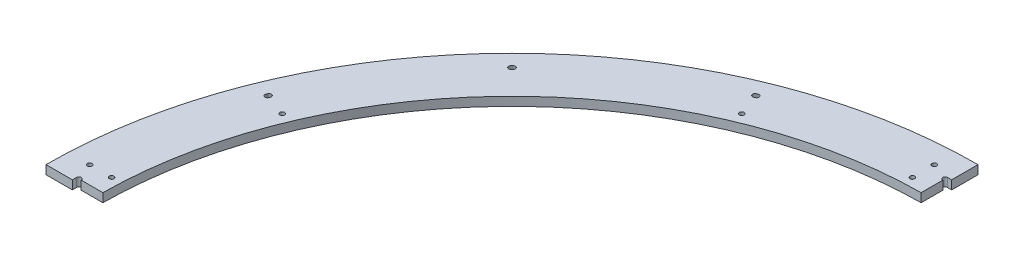
ISO-10303-21;
HEADER;
FILE_DESCRIPTION(('STEP AP214'),'2;1');
FILE_NAME('part.step','',(''),(''),'','','');
FILE_SCHEMA(('AUTOMOTIVE_DESIGN { 1 0 10303 214 1 1 1 1 }'));
ENDSEC;
DATA;
#1=APPLICATION_CONTEXT('core data for automotive mechanical design processes');
#2=APPLICATION_PROTOCOL_DEFINITION('international standard','automotive_design',2000,#1);
#3=PRODUCT_CONTEXT('',#1,'mechanical');
#4=PRODUCT('Part','Part','',(#3));
#5=PRODUCT_RELATED_PRODUCT_CATEGORY('part','',(#4));
#6=PRODUCT_DEFINITION_FORMATION('','',#4);
#7=PRODUCT_DEFINITION_CONTEXT('part definition',#1,'design');
#8=PRODUCT_DEFINITION('design','',#6,#7);
#9=PRODUCT_DEFINITION_SHAPE('','',#8);
#10=(LENGTH_UNIT() NAMED_UNIT(*) SI_UNIT(.MILLI.,.METRE.));
#11=(NAMED_UNIT(*) PLANE_ANGLE_UNIT() SI_UNIT($,.RADIAN.));
#12=(NAMED_UNIT(*) SI_UNIT($,.STERADIAN.) SOLID_ANGLE_UNIT());
#13=UNCERTAINTY_MEASURE_WITH_UNIT(LENGTH_MEASURE(1.E-05),#10,'distance_accuracy_value','');
#14=(GEOMETRIC_REPRESENTATION_CONTEXT(3) GLOBAL_UNCERTAINTY_ASSIGNED_CONTEXT((#13)) GLOBAL_UNIT_ASSIGNED_CONTEXT((#10,
#11,#12)) REPRESENTATION_CONTEXT('',''));
#15=CARTESIAN_POINT('',(0.,0.,0.));
#16=DIRECTION('',(0.,0.,1.));
#17=DIRECTION('',(1.,0.,0.));
#18=AXIS2_PLACEMENT_3D('',#15,#16,#17);
#19=CARTESIAN_POINT('',(0.,12.7,0.));
#20=DIRECTION('',(0.,-1.,0.));
#21=DIRECTION('',(0.,0.,-1.));
#22=AXIS2_PLACEMENT_3D('',#19,#20,#21);
#23=PLANE('',#22);
#24=CARTESIAN_POINT('',(0.,12.7,0.));
#25=DIRECTION('',(0.,1.,0.));
#26=DIRECTION('',(0.,0.,1.));
#27=AXIS2_PLACEMENT_3D('',#24,#25,#26);
#28=CIRCLE('',#27,652.6657);
#29=CARTESIAN_POINT('',(-602.990490798011,12.7,-249.749842770047));
#30=VERTEX_POINT('',#29);
#31=CARTESIAN_POINT('',(-603.807939634826,12.7,-247.767003433541));
#32=VERTEX_POINT('',#31);
#33=EDGE_CURVE('E222',#30,#32,#28,.T.);
#34=ORIENTED_EDGE('',*,*,#33,.F.);
#35=CARTESIAN_POINT('',(-599.869409858698,12.7,-248.457136689666));
#36=DIRECTION('',(0.,1.,0.));
#37=DIRECTION('',(0.,0.,1.));
#38=AXIS2_PLACEMENT_3D('',#35,#36,#37);
#39=CIRCLE('',#38,3.37820000000002);
#40=CARTESIAN_POINT('',(-596.748328919384,12.7,-247.164430609286));
#41=VERTEX_POINT('',#40);
#42=EDGE_CURVE('E58',#41,#30,#39,.T.);
#43=ORIENTED_EDGE('',*,*,#42,.F.);
#44=CARTESIAN_POINT('',(0.,12.7,0.));
#45=DIRECTION('',(0.,-1.,0.));
#46=DIRECTION('',(0.,0.,1.));
#47=AXIS2_PLACEMENT_3D('',#44,#45,#46);
#48=CIRCLE('',#47,645.9093);
#49=CARTESIAN_POINT('',(-597.557315519986,12.7,-245.20211763979));
#50=VERTEX_POINT('',#49);
#51=EDGE_CURVE('E213',#50,#41,#48,.T.);
#52=ORIENTED_EDGE('',*,*,#51,.F.);
#53=CARTESIAN_POINT('',(-600.682627577406,12.7,-246.484560536666));
#54=DIRECTION('',(0.,1.,0.));
#55=DIRECTION('',(0.,0.,1.));
#56=AXIS2_PLACEMENT_3D('',#53,#54,#55);
#57=CIRCLE('',#56,3.37819999999996);
#58=EDGE_CURVE('E216',#32,#50,#57,.T.);
#59=ORIENTED_EDGE('',*,*,#58,.F.);
#60=EDGE_LOOP('',(#34,#43,#52,#59));
#61=FACE_BOUND('',#60,.T.);
#62=CARTESIAN_POINT('',(0.,12.7,0.));
#63=DIRECTION('',(0.,1.,0.));
#64=DIRECTION('',(0.,0.,1.));
#65=AXIS2_PLACEMENT_3D('',#62,#63,#64);
#66=CIRCLE('',#65,652.6657);
#67=CARTESIAN_POINT('',(-460.745442176767,12.7,-462.261996566693));
#68=VERTEX_POINT('',#67);
#69=CARTESIAN_POINT('',(-462.261996566693,12.7,-460.745442176767));
#70=VERTEX_POINT('',#69);
#71=EDGE_CURVE('E248',#68,#70,#66,.T.);
#72=ORIENTED_EDGE('',*,*,#71,.F.);
#73=CARTESIAN_POINT('',(-458.360622118411,12.7,-459.869326817384));
#74=DIRECTION('',(0.,1.,0.));
#75=DIRECTION('',(0.,0.,1.));
#76=AXIS2_PLACEMENT_3D('',#73,#74,#75);
#77=CIRCLE('',#76,3.37819999999989);
#78=CARTESIAN_POINT('',(-455.975802060054,12.7,-457.476657068075));
#79=VERTEX_POINT('',#78);
#80=EDGE_CURVE('E66',#79,#68,#77,.T.);
#81=ORIENTED_EDGE('',*,*,#80,.F.);
#82=CARTESIAN_POINT('',(0.,12.7,0.));
#83=DIRECTION('',(0.,-1.,0.));
#84=DIRECTION('',(0.,0.,1.));
#85=AXIS2_PLACEMENT_3D('',#82,#83,#84);
#86=CIRCLE('',#85,645.9093);
#87=CARTESIAN_POINT('',(-457.476657068075,12.7,-455.975802060054));
#88=VERTEX_POINT('',#87);
#89=EDGE_CURVE('E237',#88,#79,#86,.T.);
#90=ORIENTED_EDGE('',*,*,#89,.F.);
#91=CARTESIAN_POINT('',(-459.869326817384,12.7,-458.360622118411));
#92=DIRECTION('',(0.,1.,0.));
#93=DIRECTION('',(0.,0.,1.));
#94=AXIS2_PLACEMENT_3D('',#91,#92,#93);
#95=CIRCLE('',#94,3.37819999999989);
#96=EDGE_CURVE('E252',#70,#88,#95,.T.);
#97=ORIENTED_EDGE('',*,*,#96,.F.);
#98=EDGE_LOOP('',(#72,#81,#90,#97));
#99=FACE_BOUND('',#98,.T.);
#100=CARTESIAN_POINT('',(0.,12.7,0.));
#101=DIRECTION('',(0.,1.,0.));
#102=DIRECTION('',(0.,0.,1.));
#103=AXIS2_PLACEMENT_3D('',#100,#101,#102);
#104=CIRCLE('',#103,652.6657);
#105=CARTESIAN_POINT('',(-247.767003433541,12.7,-603.807939634826));
#106=VERTEX_POINT('',#105);
#107=CARTESIAN_POINT('',(-249.749842770047,12.7,-602.990490798011));
#108=VERTEX_POINT('',#107);
#109=EDGE_CURVE('E279',#106,#108,#104,.T.);
#110=ORIENTED_EDGE('',*,*,#109,.F.);
#111=CARTESIAN_POINT('',(-246.484560536666,12.7,-600.682627577406));
#112=DIRECTION('',(0.,1.,0.));
#113=DIRECTION('',(0.,0.,1.));
#114=AXIS2_PLACEMENT_3D('',#111,#112,#113);
#115=CIRCLE('',#114,3.37819999999987);
#116=CARTESIAN_POINT('',(-245.202117639791,12.7,-597.557315519986));
#117=VERTEX_POINT('',#116);
#118=EDGE_CURVE('E277',#117,#106,#115,.T.);
#119=ORIENTED_EDGE('',*,*,#118,.F.);
#120=CARTESIAN_POINT('',(0.,12.7,0.));
#121=DIRECTION('',(0.,-1.,0.));
#122=DIRECTION('',(0.,0.,1.));
#123=AXIS2_PLACEMENT_3D('',#120,#121,#122);
#124=CIRCLE('',#123,645.9093);
#125=CARTESIAN_POINT('',(-247.164430609286,12.7,-596.748328919384));
#126=VERTEX_POINT('',#125);
#127=EDGE_CURVE('E267',#126,#117,#124,.T.);
#128=ORIENTED_EDGE('',*,*,#127,.F.);
#129=CARTESIAN_POINT('',(-248.457136689666,12.7,-599.869409858698));
#130=DIRECTION('',(0.,1.,0.));
#131=DIRECTION('',(0.,0.,1.));
#132=AXIS2_PLACEMENT_3D('',#129,#130,#131);
#133=CIRCLE('',#132,3.3781999999999);
#134=EDGE_CURVE('E282',#108,#126,#133,.T.);
#135=ORIENTED_EDGE('',*,*,#134,.F.);
#136=EDGE_LOOP('',(#110,#119,#128,#135));
#137=FACE_BOUND('',#136,.T.);
#138=CARTESIAN_POINT('',(-31.75,12.7,-642.9375));
#139=DIRECTION('',(0.,1.,0.));
#140=DIRECTION('',(0.,0.,1.));
#141=AXIS2_PLACEMENT_3D('',#138,#139,#140);
#142=CIRCLE('',#141,3.3782);
#143=CARTESIAN_POINT('',(-31.75,12.7,-639.5593));
#144=VERTEX_POINT('',#143);
#145=EDGE_CURVE('E314',#144,#144,#142,.T.);
#146=ORIENTED_EDGE('',*,*,#145,.F.);
#147=EDGE_LOOP('',(#146));
#148=FACE_BOUND('',#147,.T.);
#149=CARTESIAN_POINT('',(-31.75,12.7,-611.1875));
#150=DIRECTION('',(0.,1.,0.));
#151=DIRECTION('',(0.,0.,1.));
#152=AXIS2_PLACEMENT_3D('',#149,#150,#151);
#153=CIRCLE('',#152,3.3782);
#154=CARTESIAN_POINT('',(-31.75,12.7,-607.8093));
#155=VERTEX_POINT('',#154);
#156=EDGE_CURVE('E320',#155,#155,#153,.T.);
#157=ORIENTED_EDGE('',*,*,#156,.F.);
#158=EDGE_LOOP('',(#157));
#159=FACE_BOUND('',#158,.T.);
#160=CARTESIAN_POINT('',(-611.1875,12.7,-31.75));
#161=DIRECTION('',(0.,1.,0.));
#162=DIRECTION('',(0.,0.,1.));
#163=AXIS2_PLACEMENT_3D('',#160,#161,#162);
#164=CIRCLE('',#163,3.3782);
#165=CARTESIAN_POINT('',(-611.1875,12.7,-28.3718));
#166=VERTEX_POINT('',#165);
#167=EDGE_CURVE('E326',#166,#166,#164,.T.);
#168=ORIENTED_EDGE('',*,*,#167,.F.);
#169=EDGE_LOOP('',(#168));
#170=FACE_BOUND('',#169,.T.);
#171=CARTESIAN_POINT('',(-642.9375,12.7,-31.75));
#172=DIRECTION('',(0.,1.,0.));
#173=DIRECTION('',(0.,0.,1.));
#174=AXIS2_PLACEMENT_3D('',#171,#172,#173);
#175=CIRCLE('',#174,3.3782);
#176=CARTESIAN_POINT('',(-642.9375,12.7,-28.3718));
#177=VERTEX_POINT('',#176);
#178=EDGE_CURVE('E332',#177,#177,#175,.T.);
#179=ORIENTED_EDGE('',*,*,#178,.F.);
#180=EDGE_LOOP('',(#179));
#181=FACE_BOUND('',#180,.T.);
#182=CARTESIAN_POINT('',(-567.596939292465,12.7,-235.106350216397));
#183=DIRECTION('',(0.,1.,0.));
#184=DIRECTION('',(0.,0.,1.));
#185=AXIS2_PLACEMENT_3D('',#182,#183,#184);
#186=CIRCLE('',#185,3.3782);
#187=CARTESIAN_POINT('',(-567.596939292465,12.7,-231.728150216397));
#188=VERTEX_POINT('',#187);
#189=EDGE_CURVE('E338',#188,#188,#186,.T.);
#190=ORIENTED_EDGE('',*,*,#189,.F.);
#191=EDGE_LOOP('',(#190));
#192=FACE_BOUND('',#191,.T.);
#193=CARTESIAN_POINT('',(-235.106350216398,12.7,-567.596939292465));
#194=DIRECTION('',(0.,1.,0.));
#195=DIRECTION('',(0.,0.,1.));
#196=AXIS2_PLACEMENT_3D('',#193,#194,#195);
#197=CIRCLE('',#196,3.3782);
#198=CARTESIAN_POINT('',(-235.106350216398,12.7,-564.218739292465));
#199=VERTEX_POINT('',#198);
#200=EDGE_CURVE('E344',#199,#199,#197,.T.);
#201=ORIENTED_EDGE('',*,*,#200,.F.);
#202=EDGE_LOOP('',(#201));
#203=FACE_BOUND('',#202,.T.);
#204=DIRECTION('',(-1.,0.,0.));
#205=VECTOR('',#204,1.);
#206=CARTESIAN_POINT('',(-6.35,12.7,-636.5875));
#207=LINE('',#206,#205);
#208=CARTESIAN_POINT('',(-0.317499999999959,12.7,-636.5875));
#209=VERTEX_POINT('',#208);
#210=CARTESIAN_POINT('',(-6.35,12.7,-636.5875));
#211=VERTEX_POINT('',#210);
#212=EDGE_CURVE('E367',#209,#211,#207,.T.);
#213=ORIENTED_EDGE('',*,*,#212,.F.);
#214=DIRECTION('',(0.,0.,1.));
#215=VECTOR('',#214,1.);
#216=CARTESIAN_POINT('',(-0.317499999999959,12.7,-674.6875));
#217=LINE('',#216,#215);
#218=CARTESIAN_POINT('',(-0.317499999999959,12.7,-674.687425294113));
#219=VERTEX_POINT('',#218);
#220=EDGE_CURVE('E298',#219,#209,#217,.T.);
#221=ORIENTED_EDGE('',*,*,#220,.F.);
#222=CARTESIAN_POINT('',(0.,12.7,0.));
#223=DIRECTION('',(0.,1.,0.));
#224=DIRECTION('',(0.,0.,-1.));
#225=AXIS2_PLACEMENT_3D('',#222,#223,#224);
#226=CIRCLE('',#225,674.6875);
#227=CARTESIAN_POINT('',(-674.687425294113,12.7,-0.317499999999971));
#228=VERTEX_POINT('',#227);
#229=EDGE_CURVE('E51',#219,#228,#226,.T.);
#230=ORIENTED_EDGE('',*,*,#229,.T.);
#231=DIRECTION('',(-1.,0.,0.));
#232=VECTOR('',#231,1.);
#233=CARTESIAN_POINT('',(-674.6875,12.7,-0.317499999999971));
#234=LINE('',#233,#232);
#235=CARTESIAN_POINT('',(-636.5875,12.7,-0.317500000000082));
#236=VERTEX_POINT('',#235);
#237=EDGE_CURVE('E229',#236,#228,#234,.T.);
#238=ORIENTED_EDGE('',*,*,#237,.F.);
#239=DIRECTION('',(0.,0.,1.));
#240=VECTOR('',#239,1.);
#241=CARTESIAN_POINT('',(-636.5875,12.7,6.35000000000012));
#242=LINE('',#241,#240);
#243=CARTESIAN_POINT('',(-636.5875,12.7,-6.34999999999988));
#244=VERTEX_POINT('',#243);
#245=EDGE_CURVE('E384',#244,#236,#242,.T.);
#246=ORIENTED_EDGE('',*,*,#245,.F.);
#247=CARTESIAN_POINT('',(-633.1585,12.7,-6.34999999999988));
#248=DIRECTION('',(0.,1.,0.));
#249=DIRECTION('',(0.,0.,1.));
#250=AXIS2_PLACEMENT_3D('',#247,#248,#249);
#251=CIRCLE('',#250,3.429);
#252=CARTESIAN_POINT('',(-629.7295,12.7,-6.34999999999988));
#253=VERTEX_POINT('',#252);
#254=EDGE_CURVE('E355',#253,#244,#251,.T.);
#255=ORIENTED_EDGE('',*,*,#254,.F.);
#256=DIRECTION('',(-1.,0.,0.));
#257=VECTOR('',#256,1.);
#258=CARTESIAN_POINT('',(-598.453812049226,12.7,-6.34999999999989));
#259=LINE('',#258,#257);
#260=CARTESIAN_POINT('',(-598.453812049226,12.7,-6.34999999999989));
#261=VERTEX_POINT('',#260);
#262=EDGE_CURVE('E363',#261,#253,#259,.T.);
#263=ORIENTED_EDGE('',*,*,#262,.F.);
#264=CARTESIAN_POINT('',(0.,12.7,0.));
#265=DIRECTION('',(0.,-1.,0.));
#266=DIRECTION('',(0.,0.,-1.));
#267=AXIS2_PLACEMENT_3D('',#264,#265,#266);
#268=CIRCLE('',#267,598.4875);
#269=CARTESIAN_POINT('',(-6.35,12.7,-598.453812049226));
#270=VERTEX_POINT('',#269);
#271=EDGE_CURVE('E395',#261,#270,#268,.T.);
#272=ORIENTED_EDGE('',*,*,#271,.T.);
#273=DIRECTION('',(0.,0.,1.));
#274=VECTOR('',#273,1.);
#275=CARTESIAN_POINT('',(-6.35,12.7,-598.453812049226));
#276=LINE('',#275,#274);
#277=CARTESIAN_POINT('',(-6.35,12.7,-629.7295));
#278=VERTEX_POINT('',#277);
#279=EDGE_CURVE('E370',#278,#270,#276,.T.);
#280=ORIENTED_EDGE('',*,*,#279,.F.);
#281=CARTESIAN_POINT('',(-6.35,12.7,-633.1585));
#282=DIRECTION('',(0.,1.,0.));
#283=DIRECTION('',(0.,0.,1.));
#284=AXIS2_PLACEMENT_3D('',#281,#282,#283);
#285=CIRCLE('',#284,3.429);
#286=EDGE_CURVE('E357',#211,#278,#285,.T.);
#287=ORIENTED_EDGE('',*,*,#286,.F.);
#288=EDGE_LOOP('',(#213,#221,#230,#238,#246,#255,#263,#272,#280,#287));
#289=FACE_BOUND('',#288,.T.);
#290=ADVANCED_FACE('F43',(#61,#99,#137,#148,#159,#170,#181,#192,#203,#289),#23,.F.);
#291=CARTESIAN_POINT('',(0.,0.,0.));
#292=DIRECTION('',(0.,-1.,0.));
#293=DIRECTION('',(0.,0.,-1.));
#294=AXIS2_PLACEMENT_3D('',#291,#292,#293);
#295=PLANE('',#294);
#296=CARTESIAN_POINT('',(-599.869409858698,0.,-248.457136689666));
#297=DIRECTION('',(0.,1.,0.));
#298=DIRECTION('',(0.,0.,1.));
#299=AXIS2_PLACEMENT_3D('',#296,#297,#298);
#300=CIRCLE('',#299,3.37820000000002);
#301=CARTESIAN_POINT('',(-596.748328919384,0.,-247.164430609286));
#302=VERTEX_POINT('',#301);
#303=CARTESIAN_POINT('',(-602.990490798011,0.,-249.749842770047));
#304=VERTEX_POINT('',#303);
#305=EDGE_CURVE('E194',#302,#304,#300,.T.);
#306=ORIENTED_EDGE('',*,*,#305,.T.);
#307=CARTESIAN_POINT('',(0.,0.,0.));
#308=DIRECTION('',(0.,1.,0.));
#309=DIRECTION('',(0.,0.,1.));
#310=AXIS2_PLACEMENT_3D('',#307,#308,#309);
#311=CIRCLE('',#310,652.6657);
#312=CARTESIAN_POINT('',(-603.807939634826,0.,-247.767003433541));
#313=VERTEX_POINT('',#312);
#314=EDGE_CURVE('E204',#304,#313,#311,.T.);
#315=ORIENTED_EDGE('',*,*,#314,.T.);
#316=CARTESIAN_POINT('',(-600.682627577406,0.,-246.484560536666));
#317=DIRECTION('',(0.,1.,0.));
#318=DIRECTION('',(0.,0.,1.));
#319=AXIS2_PLACEMENT_3D('',#316,#317,#318);
#320=CIRCLE('',#319,3.37819999999996);
#321=CARTESIAN_POINT('',(-597.557315519986,0.,-245.20211763979));
#322=VERTEX_POINT('',#321);
#323=EDGE_CURVE('E208',#313,#322,#320,.T.);
#324=ORIENTED_EDGE('',*,*,#323,.T.);
#325=CARTESIAN_POINT('',(0.,0.,0.));
#326=DIRECTION('',(0.,-1.,0.));
#327=DIRECTION('',(0.,0.,1.));
#328=AXIS2_PLACEMENT_3D('',#325,#326,#327);
#329=CIRCLE('',#328,645.9093);
#330=EDGE_CURVE('E200',#322,#302,#329,.T.);
#331=ORIENTED_EDGE('',*,*,#330,.T.);
#332=EDGE_LOOP('',(#306,#315,#324,#331));
#333=FACE_BOUND('',#332,.T.);
#334=CARTESIAN_POINT('',(-458.360622118411,0.,-459.869326817384));
#335=DIRECTION('',(0.,1.,0.));
#336=DIRECTION('',(0.,0.,1.));
#337=AXIS2_PLACEMENT_3D('',#334,#335,#336);
#338=CIRCLE('',#337,3.37819999999989);
#339=CARTESIAN_POINT('',(-455.975802060054,0.,-457.476657068075));
#340=VERTEX_POINT('',#339);
#341=CARTESIAN_POINT('',(-460.745442176767,0.,-462.261996566693));
#342=VERTEX_POINT('',#341);
#343=EDGE_CURVE('E233',#340,#342,#338,.T.);
#344=ORIENTED_EDGE('',*,*,#343,.T.);
#345=CARTESIAN_POINT('',(0.,0.,0.));
#346=DIRECTION('',(0.,1.,0.));
#347=DIRECTION('',(0.,0.,1.));
#348=AXIS2_PLACEMENT_3D('',#345,#346,#347);
#349=CIRCLE('',#348,652.6657);
#350=CARTESIAN_POINT('',(-462.261996566693,0.,-460.745442176767));
#351=VERTEX_POINT('',#350);
#352=EDGE_CURVE('E236',#342,#351,#349,.T.);
#353=ORIENTED_EDGE('',*,*,#352,.T.);
#354=CARTESIAN_POINT('',(-459.869326817384,0.,-458.360622118411));
#355=DIRECTION('',(0.,1.,0.));
#356=DIRECTION('',(0.,0.,1.));
#357=AXIS2_PLACEMENT_3D('',#354,#355,#356);
#358=CIRCLE('',#357,3.37819999999989);
#359=CARTESIAN_POINT('',(-457.476657068075,0.,-455.975802060054));
#360=VERTEX_POINT('',#359);
#361=EDGE_CURVE('E240',#351,#360,#358,.T.);
#362=ORIENTED_EDGE('',*,*,#361,.T.);
#363=CARTESIAN_POINT('',(0.,0.,0.));
#364=DIRECTION('',(0.,-1.,0.));
#365=DIRECTION('',(0.,0.,1.));
#366=AXIS2_PLACEMENT_3D('',#363,#364,#365);
#367=CIRCLE('',#366,645.9093);
#368=EDGE_CURVE('E243',#360,#340,#367,.T.);
#369=ORIENTED_EDGE('',*,*,#368,.T.);
#370=EDGE_LOOP('',(#344,#353,#362,#369));
#371=FACE_BOUND('',#370,.T.);
#372=CARTESIAN_POINT('',(-246.484560536666,0.,-600.682627577406));
#373=DIRECTION('',(0.,1.,0.));
#374=DIRECTION('',(0.,0.,1.));
#375=AXIS2_PLACEMENT_3D('',#372,#373,#374);
#376=CIRCLE('',#375,3.37819999999987);
#377=CARTESIAN_POINT('',(-245.202117639791,0.,-597.557315519986));
#378=VERTEX_POINT('',#377);
#379=CARTESIAN_POINT('',(-247.767003433541,0.,-603.807939634826));
#380=VERTEX_POINT('',#379);
#381=EDGE_CURVE('E263',#378,#380,#376,.T.);
#382=ORIENTED_EDGE('',*,*,#381,.T.);
#383=CARTESIAN_POINT('',(0.,0.,0.));
#384=DIRECTION('',(0.,1.,0.));
#385=DIRECTION('',(0.,0.,1.));
#386=AXIS2_PLACEMENT_3D('',#383,#384,#385);
#387=CIRCLE('',#386,652.6657);
#388=CARTESIAN_POINT('',(-249.749842770047,0.,-602.990490798011));
#389=VERTEX_POINT('',#388);
#390=EDGE_CURVE('E266',#380,#389,#387,.T.);
#391=ORIENTED_EDGE('',*,*,#390,.T.);
#392=CARTESIAN_POINT('',(-248.457136689666,0.,-599.869409858698));
#393=DIRECTION('',(0.,1.,0.));
#394=DIRECTION('',(0.,0.,1.));
#395=AXIS2_PLACEMENT_3D('',#392,#393,#394);
#396=CIRCLE('',#395,3.3781999999999);
#397=CARTESIAN_POINT('',(-247.164430609286,0.,-596.748328919384));
#398=VERTEX_POINT('',#397);
#399=EDGE_CURVE('E270',#389,#398,#396,.T.);
#400=ORIENTED_EDGE('',*,*,#399,.T.);
#401=CARTESIAN_POINT('',(0.,0.,0.));
#402=DIRECTION('',(0.,-1.,0.));
#403=DIRECTION('',(0.,0.,1.));
#404=AXIS2_PLACEMENT_3D('',#401,#402,#403);
#405=CIRCLE('',#404,645.9093);
#406=EDGE_CURVE('E273',#398,#378,#405,.T.);
#407=ORIENTED_EDGE('',*,*,#406,.T.);
#408=EDGE_LOOP('',(#382,#391,#400,#407));
#409=FACE_BOUND('',#408,.T.);
#410=DIRECTION('',(0.,0.,1.));
#411=VECTOR('',#410,1.);
#412=CARTESIAN_POINT('',(-0.317499999999959,0.,-674.6875));
#413=LINE('',#412,#411);
#414=CARTESIAN_POINT('',(-0.317499999999959,0.,-674.687425294113));
#415=VERTEX_POINT('',#414);
#416=CARTESIAN_POINT('',(-0.317499999999954,0.,-636.5875));
#417=VERTEX_POINT('',#416);
#418=EDGE_CURVE('E294',#415,#417,#413,.T.);
#419=ORIENTED_EDGE('',*,*,#418,.T.);
#420=DIRECTION('',(-1.,0.,0.));
#421=VECTOR('',#420,1.);
#422=CARTESIAN_POINT('',(-6.35,0.,-636.5875));
#423=LINE('',#422,#421);
#424=CARTESIAN_POINT('',(-6.35,0.,-636.5875));
#425=VERTEX_POINT('',#424);
#426=EDGE_CURVE('E366',#417,#425,#423,.T.);
#427=ORIENTED_EDGE('',*,*,#426,.T.);
#428=CARTESIAN_POINT('',(-6.35,0.,-633.1585));
#429=DIRECTION('',(0.,1.,0.));
#430=DIRECTION('',(0.,0.,1.));
#431=AXIS2_PLACEMENT_3D('',#428,#429,#430);
#432=CIRCLE('',#431,3.429);
#433=CARTESIAN_POINT('',(-6.35,0.,-629.7295));
#434=VERTEX_POINT('',#433);
#435=EDGE_CURVE('E350',#425,#434,#432,.T.);
#436=ORIENTED_EDGE('',*,*,#435,.T.);
#437=DIRECTION('',(0.,0.,1.));
#438=VECTOR('',#437,1.);
#439=CARTESIAN_POINT('',(-6.35,0.,-598.453812049226));
#440=LINE('',#439,#438);
#441=CARTESIAN_POINT('',(-6.35,0.,-598.453812049226));
#442=VERTEX_POINT('',#441);
#443=EDGE_CURVE('E364',#434,#442,#440,.T.);
#444=ORIENTED_EDGE('',*,*,#443,.T.);
#445=CARTESIAN_POINT('',(0.,0.,0.));
#446=DIRECTION('',(0.,-1.,0.));
#447=DIRECTION('',(0.,0.,-1.));
#448=AXIS2_PLACEMENT_3D('',#445,#446,#447);
#449=CIRCLE('',#448,598.4875);
#450=CARTESIAN_POINT('',(-598.453812049226,0.,-6.34999999999989));
#451=VERTEX_POINT('',#450);
#452=EDGE_CURVE('E377',#451,#442,#449,.T.);
#453=ORIENTED_EDGE('',*,*,#452,.F.);
#454=DIRECTION('',(-1.,0.,0.));
#455=VECTOR('',#454,1.);
#456=CARTESIAN_POINT('',(-598.453812049226,0.,-6.34999999999989));
#457=LINE('',#456,#455);
#458=CARTESIAN_POINT('',(-629.7295,0.,-6.34999999999988));
#459=VERTEX_POINT('',#458);
#460=EDGE_CURVE('E380',#451,#459,#457,.T.);
#461=ORIENTED_EDGE('',*,*,#460,.T.);
#462=CARTESIAN_POINT('',(-633.1585,0.,-6.34999999999988));
#463=DIRECTION('',(0.,1.,0.));
#464=DIRECTION('',(0.,0.,1.));
#465=AXIS2_PLACEMENT_3D('',#462,#463,#464);
#466=CIRCLE('',#465,3.429);
#467=CARTESIAN_POINT('',(-636.5875,0.,-6.34999999999988));
#468=VERTEX_POINT('',#467);
#469=EDGE_CURVE('E351',#459,#468,#466,.T.);
#470=ORIENTED_EDGE('',*,*,#469,.T.);
#471=DIRECTION('',(0.,0.,1.));
#472=VECTOR('',#471,1.);
#473=CARTESIAN_POINT('',(-636.5875,0.,6.35000000000012));
#474=LINE('',#473,#472);
#475=CARTESIAN_POINT('',(-636.5875,0.,-0.317500000000082));
#476=VERTEX_POINT('',#475);
#477=EDGE_CURVE('E383',#468,#476,#474,.T.);
#478=ORIENTED_EDGE('',*,*,#477,.T.);
#479=DIRECTION('',(-1.,0.,0.));
#480=VECTOR('',#479,1.);
#481=CARTESIAN_POINT('',(-674.6875,0.,-0.317499999999971));
#482=LINE('',#481,#480);
#483=CARTESIAN_POINT('',(-674.687425294113,0.,-0.317499999999971));
#484=VERTEX_POINT('',#483);
#485=EDGE_CURVE('E304',#476,#484,#482,.T.);
#486=ORIENTED_EDGE('',*,*,#485,.T.);
#487=CARTESIAN_POINT('',(0.,0.,0.));
#488=DIRECTION('',(0.,1.,0.));
#489=DIRECTION('',(0.,0.,-1.));
#490=AXIS2_PLACEMENT_3D('',#487,#488,#489);
#491=CIRCLE('',#490,674.6875);
#492=EDGE_CURVE('E398',#415,#484,#491,.T.);
#493=ORIENTED_EDGE('',*,*,#492,.F.);
#494=EDGE_LOOP('',(#419,#427,#436,#444,#453,#461,#470,#478,#486,#493));
#495=FACE_BOUND('',#494,.T.);
#496=CARTESIAN_POINT('',(-31.75,0.,-642.9375));
#497=DIRECTION('',(0.,1.,0.));
#498=DIRECTION('',(0.,0.,1.));
#499=AXIS2_PLACEMENT_3D('',#496,#497,#498);
#500=CIRCLE('',#499,3.3782);
#501=CARTESIAN_POINT('',(-31.75,0.,-639.5593));
#502=VERTEX_POINT('',#501);
#503=EDGE_CURVE('E317',#502,#502,#500,.T.);
#504=ORIENTED_EDGE('',*,*,#503,.T.);
#505=EDGE_LOOP('',(#504));
#506=FACE_BOUND('',#505,.T.);
#507=CARTESIAN_POINT('',(-31.75,0.,-611.1875));
#508=DIRECTION('',(0.,1.,0.));
#509=DIRECTION('',(0.,0.,1.));
#510=AXIS2_PLACEMENT_3D('',#507,#508,#509);
#511=CIRCLE('',#510,3.3782);
#512=CARTESIAN_POINT('',(-31.75,0.,-607.8093));
#513=VERTEX_POINT('',#512);
#514=EDGE_CURVE('E323',#513,#513,#511,.T.);
#515=ORIENTED_EDGE('',*,*,#514,.T.);
#516=EDGE_LOOP('',(#515));
#517=FACE_BOUND('',#516,.T.);
#518=CARTESIAN_POINT('',(-611.1875,0.,-31.75));
#519=DIRECTION('',(0.,1.,0.));
#520=DIRECTION('',(0.,0.,1.));
#521=AXIS2_PLACEMENT_3D('',#518,#519,#520);
#522=CIRCLE('',#521,3.3782);
#523=CARTESIAN_POINT('',(-611.1875,0.,-28.3718));
#524=VERTEX_POINT('',#523);
#525=EDGE_CURVE('E329',#524,#524,#522,.T.);
#526=ORIENTED_EDGE('',*,*,#525,.T.);
#527=EDGE_LOOP('',(#526));
#528=FACE_BOUND('',#527,.T.);
#529=CARTESIAN_POINT('',(-642.9375,0.,-31.75));
#530=DIRECTION('',(0.,1.,0.));
#531=DIRECTION('',(0.,0.,1.));
#532=AXIS2_PLACEMENT_3D('',#529,#530,#531);
#533=CIRCLE('',#532,3.3782);
#534=CARTESIAN_POINT('',(-642.9375,0.,-28.3718));
#535=VERTEX_POINT('',#534);
#536=EDGE_CURVE('E335',#535,#535,#533,.T.);
#537=ORIENTED_EDGE('',*,*,#536,.T.);
#538=EDGE_LOOP('',(#537));
#539=FACE_BOUND('',#538,.T.);
#540=CARTESIAN_POINT('',(-567.596939292465,0.,-235.106350216397));
#541=DIRECTION('',(0.,1.,0.));
#542=DIRECTION('',(0.,0.,1.));
#543=AXIS2_PLACEMENT_3D('',#540,#541,#542);
#544=CIRCLE('',#543,3.3782);
#545=CARTESIAN_POINT('',(-567.596939292465,0.,-231.728150216397));
#546=VERTEX_POINT('',#545);
#547=EDGE_CURVE('E341',#546,#546,#544,.T.);
#548=ORIENTED_EDGE('',*,*,#547,.T.);
#549=EDGE_LOOP('',(#548));
#550=FACE_BOUND('',#549,.T.);
#551=CARTESIAN_POINT('',(-235.106350216398,0.,-567.596939292465));
#552=DIRECTION('',(0.,1.,0.));
#553=DIRECTION('',(0.,0.,1.));
#554=AXIS2_PLACEMENT_3D('',#551,#552,#553);
#555=CIRCLE('',#554,3.3782);
#556=CARTESIAN_POINT('',(-235.106350216398,0.,-564.218739292465));
#557=VERTEX_POINT('',#556);
#558=EDGE_CURVE('E347',#557,#557,#555,.T.);
#559=ORIENTED_EDGE('',*,*,#558,.T.);
#560=EDGE_LOOP('',(#559));
#561=FACE_BOUND('',#560,.T.);
#562=ADVANCED_FACE('F210',(#333,#371,#409,#495,#506,#517,#528,#539,#550,#561),#295,.T.);
#563=CARTESIAN_POINT('',(0.,12.7,0.));
#564=DIRECTION('',(0.,-1.,0.));
#565=DIRECTION('',(0.,0.,-1.));
#566=AXIS2_PLACEMENT_3D('',#563,#564,#565);
#567=CYLINDRICAL_SURFACE('',#566,598.4875);
#568=ORIENTED_EDGE('',*,*,#452,.T.);
#569=DIRECTION('',(0.,1.,0.));
#570=VECTOR('',#569,1.);
#571=CARTESIAN_POINT('',(-6.35,0.,-598.453812049226));
#572=LINE('',#571,#570);
#573=EDGE_CURVE('E369',#442,#270,#572,.T.);
#574=ORIENTED_EDGE('',*,*,#573,.T.);
#575=ORIENTED_EDGE('',*,*,#271,.F.);
#576=DIRECTION('',(0.,1.,0.));
#577=VECTOR('',#576,1.);
#578=CARTESIAN_POINT('',(-598.453812049226,0.,-6.34999999999989));
#579=LINE('',#578,#577);
#580=EDGE_CURVE('E387',#451,#261,#579,.T.);
#581=ORIENTED_EDGE('',*,*,#580,.F.);
#582=EDGE_LOOP('',(#568,#574,#575,#581));
#583=FACE_BOUND('',#582,.T.);
#584=ADVANCED_FACE('F45',(#583),#567,.F.);
#585=CARTESIAN_POINT('',(0.,12.7,0.));
#586=DIRECTION('',(0.,-1.,0.));
#587=DIRECTION('',(0.,0.,-1.));
#588=AXIS2_PLACEMENT_3D('',#585,#586,#587);
#589=CYLINDRICAL_SURFACE('',#588,674.6875);
#590=ORIENTED_EDGE('',*,*,#229,.F.);
#591=DIRECTION('',(0.,-1.,0.));
#592=VECTOR('',#591,1.);
#593=CARTESIAN_POINT('',(-0.317499999999959,12.7,-674.687425294113));
#594=LINE('',#593,#592);
#595=EDGE_CURVE('E303',#219,#415,#594,.T.);
#596=ORIENTED_EDGE('',*,*,#595,.T.);
#597=ORIENTED_EDGE('',*,*,#492,.T.);
#598=DIRECTION('',(0.,-1.,0.));
#599=VECTOR('',#598,1.);
#600=CARTESIAN_POINT('',(-674.687425294113,12.7,-0.317499999999971));
#601=LINE('',#600,#599);
#602=EDGE_CURVE('E311',#484,#228,#601,.F.);
#603=ORIENTED_EDGE('',*,*,#602,.T.);
#604=EDGE_LOOP('',(#590,#596,#597,#603));
#605=FACE_BOUND('',#604,.T.);
#606=ADVANCED_FACE('F406',(#605),#589,.T.);
#607=CARTESIAN_POINT('',(-636.5875,0.,6.35000000000012));
#608=DIRECTION('',(-1.,0.,0.));
#609=DIRECTION('',(0.,0.,1.));
#610=AXIS2_PLACEMENT_3D('',#607,#608,#609);
#611=PLANE('',#610);
#612=ORIENTED_EDGE('',*,*,#245,.T.);
#613=DIRECTION('',(0.,1.,0.));
#614=VECTOR('',#613,1.);
#615=CARTESIAN_POINT('',(-636.5875,0.,-0.317500000000082));
#616=LINE('',#615,#614);
#617=EDGE_CURVE('E300',#476,#236,#616,.T.);
#618=ORIENTED_EDGE('',*,*,#617,.F.);
#619=ORIENTED_EDGE('',*,*,#477,.F.);
#620=DIRECTION('',(0.,1.,0.));
#621=VECTOR('',#620,1.);
#622=CARTESIAN_POINT('',(-636.5875,0.,-6.34999999999988));
#623=LINE('',#622,#621);
#624=EDGE_CURVE('E372',#468,#244,#623,.T.);
#625=ORIENTED_EDGE('',*,*,#624,.T.);
#626=EDGE_LOOP('',(#612,#618,#619,#625));
#627=FACE_BOUND('',#626,.T.);
#628=ADVANCED_FACE('F416',(#627),#611,.F.);
#629=CARTESIAN_POINT('',(-598.453812049226,0.,-6.34999999999989));
#630=DIRECTION('',(0.,0.,-1.));
#631=DIRECTION('',(-1.,0.,0.));
#632=AXIS2_PLACEMENT_3D('',#629,#630,#631);
#633=PLANE('',#632);
#634=ORIENTED_EDGE('',*,*,#262,.T.);
#635=DIRECTION('',(0.,1.,0.));
#636=VECTOR('',#635,1.);
#637=CARTESIAN_POINT('',(-629.7295,0.,-6.34999999999988));
#638=LINE('',#637,#636);
#639=EDGE_CURVE('E13',#253,#459,#638,.F.);
#640=ORIENTED_EDGE('',*,*,#639,.T.);
#641=ORIENTED_EDGE('',*,*,#460,.F.);
#642=ORIENTED_EDGE('',*,*,#580,.T.);
#643=EDGE_LOOP('',(#634,#640,#641,#642));
#644=FACE_BOUND('',#643,.T.);
#645=ADVANCED_FACE('F442',(#644),#633,.F.);
#646=CARTESIAN_POINT('',(-6.35,0.,-598.453812049226));
#647=DIRECTION('',(-1.,0.,0.));
#648=DIRECTION('',(0.,0.,1.));
#649=AXIS2_PLACEMENT_3D('',#646,#647,#648);
#650=PLANE('',#649);
#651=ORIENTED_EDGE('',*,*,#443,.F.);
#652=DIRECTION('',(0.,1.,0.));
#653=VECTOR('',#652,1.);
#654=CARTESIAN_POINT('',(-6.35,0.,-629.7295));
#655=LINE('',#654,#653);
#656=EDGE_CURVE('E354',#434,#278,#655,.T.);
#657=ORIENTED_EDGE('',*,*,#656,.T.);
#658=ORIENTED_EDGE('',*,*,#279,.T.);
#659=ORIENTED_EDGE('',*,*,#573,.F.);
#660=EDGE_LOOP('',(#651,#657,#658,#659));
#661=FACE_BOUND('',#660,.T.);
#662=ADVANCED_FACE('F435',(#661),#650,.F.);
#663=CARTESIAN_POINT('',(-6.35,0.,-636.5875));
#664=DIRECTION('',(0.,0.,-1.));
#665=DIRECTION('',(-1.,0.,0.));
#666=AXIS2_PLACEMENT_3D('',#663,#664,#665);
#667=PLANE('',#666);
#668=ORIENTED_EDGE('',*,*,#426,.F.);
#669=DIRECTION('',(0.,1.,0.));
#670=VECTOR('',#669,1.);
#671=CARTESIAN_POINT('',(-0.317499999999954,0.,-636.5875));
#672=LINE('',#671,#670);
#673=EDGE_CURVE('E297',#417,#209,#672,.T.);
#674=ORIENTED_EDGE('',*,*,#673,.T.);
#675=ORIENTED_EDGE('',*,*,#212,.T.);
#676=DIRECTION('',(0.,1.,0.));
#677=VECTOR('',#676,1.);
#678=CARTESIAN_POINT('',(-6.35,0.,-636.5875));
#679=LINE('',#678,#677);
#680=EDGE_CURVE('E374',#425,#211,#679,.T.);
#681=ORIENTED_EDGE('',*,*,#680,.F.);
#682=EDGE_LOOP('',(#668,#674,#675,#681));
#683=FACE_BOUND('',#682,.T.);
#684=ADVANCED_FACE('F427',(#683),#667,.F.);
#685=CARTESIAN_POINT('',(-6.35,0.,-633.1585));
#686=DIRECTION('',(0.,1.,0.));
#687=DIRECTION('',(0.,0.,1.));
#688=AXIS2_PLACEMENT_3D('',#685,#686,#687);
#689=CYLINDRICAL_SURFACE('',#688,3.429);
#690=ORIENTED_EDGE('',*,*,#435,.F.);
#691=ORIENTED_EDGE('',*,*,#680,.T.);
#692=ORIENTED_EDGE('',*,*,#286,.T.);
#693=ORIENTED_EDGE('',*,*,#656,.F.);
#694=EDGE_LOOP('',(#690,#691,#692,#693));
#695=FACE_BOUND('',#694,.T.);
#696=ADVANCED_FACE('F432',(#695),#689,.F.);
#697=CARTESIAN_POINT('',(-633.1585,0.,-6.34999999999988));
#698=DIRECTION('',(0.,1.,0.));
#699=DIRECTION('',(0.,0.,1.));
#700=AXIS2_PLACEMENT_3D('',#697,#698,#699);
#701=CYLINDRICAL_SURFACE('',#700,3.429);
#702=ORIENTED_EDGE('',*,*,#469,.F.);
#703=ORIENTED_EDGE('',*,*,#639,.F.);
#704=ORIENTED_EDGE('',*,*,#254,.T.);
#705=ORIENTED_EDGE('',*,*,#624,.F.);
#706=EDGE_LOOP('',(#702,#703,#704,#705));
#707=FACE_BOUND('',#706,.T.);
#708=ADVANCED_FACE('F444',(#707),#701,.F.);
#709=CARTESIAN_POINT('',(-235.106350216398,12.7,-567.596939292465));
#710=DIRECTION('',(0.,1.,0.));
#711=DIRECTION('',(0.,0.,1.));
#712=AXIS2_PLACEMENT_3D('',#709,#710,#711);
#713=CYLINDRICAL_SURFACE('',#712,3.3782);
#714=ORIENTED_EDGE('',*,*,#558,.F.);
#715=EDGE_LOOP('',(#714));
#716=FACE_BOUND('',#715,.T.);
#717=ORIENTED_EDGE('',*,*,#200,.T.);
#718=EDGE_LOOP('',(#717));
#719=FACE_BOUND('',#718,.T.);
#720=ADVANCED_FACE('F446',(#716,#719),#713,.F.);
#721=CARTESIAN_POINT('',(-567.596939292465,12.7,-235.106350216397));
#722=DIRECTION('',(0.,1.,0.));
#723=DIRECTION('',(0.,0.,1.));
#724=AXIS2_PLACEMENT_3D('',#721,#722,#723);
#725=CYLINDRICAL_SURFACE('',#724,3.3782);
#726=ORIENTED_EDGE('',*,*,#547,.F.);
#727=EDGE_LOOP('',(#726));
#728=FACE_BOUND('',#727,.T.);
#729=ORIENTED_EDGE('',*,*,#189,.T.);
#730=EDGE_LOOP('',(#729));
#731=FACE_BOUND('',#730,.T.);
#732=ADVANCED_FACE('F452',(#728,#731),#725,.F.);
#733=CARTESIAN_POINT('',(-642.9375,12.7,-31.75));
#734=DIRECTION('',(0.,1.,0.));
#735=DIRECTION('',(0.,0.,1.));
#736=AXIS2_PLACEMENT_3D('',#733,#734,#735);
#737=CYLINDRICAL_SURFACE('',#736,3.3782);
#738=ORIENTED_EDGE('',*,*,#536,.F.);
#739=EDGE_LOOP('',(#738));
#740=FACE_BOUND('',#739,.T.);
#741=ORIENTED_EDGE('',*,*,#178,.T.);
#742=EDGE_LOOP('',(#741));
#743=FACE_BOUND('',#742,.T.);
#744=ADVANCED_FACE('F618',(#740,#743),#737,.F.);
#745=CARTESIAN_POINT('',(-611.1875,12.7,-31.75));
#746=DIRECTION('',(0.,1.,0.));
#747=DIRECTION('',(0.,0.,1.));
#748=AXIS2_PLACEMENT_3D('',#745,#746,#747);
#749=CYLINDRICAL_SURFACE('',#748,3.3782);
#750=ORIENTED_EDGE('',*,*,#525,.F.);
#751=EDGE_LOOP('',(#750));
#752=FACE_BOUND('',#751,.T.);
#753=ORIENTED_EDGE('',*,*,#167,.T.);
#754=EDGE_LOOP('',(#753));
#755=FACE_BOUND('',#754,.T.);
#756=ADVANCED_FACE('F614',(#752,#755),#749,.F.);
#757=CARTESIAN_POINT('',(-31.75,12.7,-611.1875));
#758=DIRECTION('',(0.,1.,0.));
#759=DIRECTION('',(0.,0.,1.));
#760=AXIS2_PLACEMENT_3D('',#757,#758,#759);
#761=CYLINDRICAL_SURFACE('',#760,3.3782);
#762=ORIENTED_EDGE('',*,*,#514,.F.);
#763=EDGE_LOOP('',(#762));
#764=FACE_BOUND('',#763,.T.);
#765=ORIENTED_EDGE('',*,*,#156,.T.);
#766=EDGE_LOOP('',(#765));
#767=FACE_BOUND('',#766,.T.);
#768=ADVANCED_FACE('F610',(#764,#767),#761,.F.);
#769=CARTESIAN_POINT('',(-31.75,12.7,-642.9375));
#770=DIRECTION('',(0.,1.,0.));
#771=DIRECTION('',(0.,0.,1.));
#772=AXIS2_PLACEMENT_3D('',#769,#770,#771);
#773=CYLINDRICAL_SURFACE('',#772,3.3782);
#774=ORIENTED_EDGE('',*,*,#503,.F.);
#775=EDGE_LOOP('',(#774));
#776=FACE_BOUND('',#775,.T.);
#777=ORIENTED_EDGE('',*,*,#145,.T.);
#778=EDGE_LOOP('',(#777));
#779=FACE_BOUND('',#778,.T.);
#780=ADVANCED_FACE('F606',(#776,#779),#773,.F.);
#781=CARTESIAN_POINT('',(-0.317499999999959,0.,-674.6875));
#782=DIRECTION('',(-1.,0.,0.));
#783=DIRECTION('',(0.,0.,1.));
#784=AXIS2_PLACEMENT_3D('',#781,#782,#783);
#785=PLANE('',#784);
#786=ORIENTED_EDGE('',*,*,#220,.T.);
#787=ORIENTED_EDGE('',*,*,#673,.F.);
#788=ORIENTED_EDGE('',*,*,#418,.F.);
#789=ORIENTED_EDGE('',*,*,#595,.F.);
#790=EDGE_LOOP('',(#786,#787,#788,#789));
#791=FACE_BOUND('',#790,.T.);
#792=ADVANCED_FACE('F425',(#791),#785,.F.);
#793=CARTESIAN_POINT('',(-674.6875,0.,-0.317499999999971));
#794=DIRECTION('',(0.,0.,-1.));
#795=DIRECTION('',(-1.,0.,0.));
#796=AXIS2_PLACEMENT_3D('',#793,#794,#795);
#797=PLANE('',#796);
#798=ORIENTED_EDGE('',*,*,#485,.F.);
#799=ORIENTED_EDGE('',*,*,#617,.T.);
#800=ORIENTED_EDGE('',*,*,#237,.T.);
#801=ORIENTED_EDGE('',*,*,#602,.F.);
#802=EDGE_LOOP('',(#798,#799,#800,#801));
#803=FACE_BOUND('',#802,.T.);
#804=ADVANCED_FACE('F413',(#803),#797,.F.);
#805=CARTESIAN_POINT('',(-246.484560536666,0.,-600.682627577406));
#806=DIRECTION('',(0.,1.,0.));
#807=DIRECTION('',(0.,0.,1.));
#808=AXIS2_PLACEMENT_3D('',#805,#806,#807);
#809=CYLINDRICAL_SURFACE('',#808,3.37819999999987);
#810=ORIENTED_EDGE('',*,*,#118,.T.);
#811=DIRECTION('',(0.,1.,0.));
#812=VECTOR('',#811,1.);
#813=CARTESIAN_POINT('',(-247.767003433541,0.,-603.807939634826));
#814=LINE('',#813,#812);
#815=EDGE_CURVE('E276',#380,#106,#814,.T.);
#816=ORIENTED_EDGE('',*,*,#815,.F.);
#817=ORIENTED_EDGE('',*,*,#381,.F.);
#818=DIRECTION('',(0.,1.,0.));
#819=VECTOR('',#818,1.);
#820=CARTESIAN_POINT('',(-245.202117639791,0.,-597.557315519986));
#821=LINE('',#820,#819);
#822=EDGE_CURVE('E249',#378,#117,#821,.T.);
#823=ORIENTED_EDGE('',*,*,#822,.T.);
#824=EDGE_LOOP('',(#810,#816,#817,#823));
#825=FACE_BOUND('',#824,.T.);
#826=ADVANCED_FACE('F487',(#825),#809,.F.);
#827=CARTESIAN_POINT('',(0.,0.,0.));
#828=DIRECTION('',(0.,1.,0.));
#829=DIRECTION('',(0.,0.,1.));
#830=AXIS2_PLACEMENT_3D('',#827,#828,#829);
#831=CYLINDRICAL_SURFACE('',#830,645.9093);
#832=ORIENTED_EDGE('',*,*,#127,.T.);
#833=ORIENTED_EDGE('',*,*,#822,.F.);
#834=ORIENTED_EDGE('',*,*,#406,.F.);
#835=DIRECTION('',(0.,1.,0.));
#836=VECTOR('',#835,1.);
#837=CARTESIAN_POINT('',(-247.164430609286,0.,-596.748328919384));
#838=LINE('',#837,#836);
#839=EDGE_CURVE('E288',#398,#126,#838,.T.);
#840=ORIENTED_EDGE('',*,*,#839,.T.);
#841=EDGE_LOOP('',(#832,#833,#834,#840));
#842=FACE_BOUND('',#841,.T.);
#843=ADVANCED_FACE('F492',(#842),#831,.T.);
#844=CARTESIAN_POINT('',(-248.457136689666,0.,-599.869409858698));
#845=DIRECTION('',(0.,1.,0.));
#846=DIRECTION('',(0.,0.,1.));
#847=AXIS2_PLACEMENT_3D('',#844,#845,#846);
#848=CYLINDRICAL_SURFACE('',#847,3.3781999999999);
#849=ORIENTED_EDGE('',*,*,#134,.T.);
#850=ORIENTED_EDGE('',*,*,#839,.F.);
#851=ORIENTED_EDGE('',*,*,#399,.F.);
#852=DIRECTION('',(0.,1.,0.));
#853=VECTOR('',#852,1.);
#854=CARTESIAN_POINT('',(-249.749842770047,0.,-602.990490798011));
#855=LINE('',#854,#853);
#856=EDGE_CURVE('E290',#389,#108,#855,.T.);
#857=ORIENTED_EDGE('',*,*,#856,.T.);
#858=EDGE_LOOP('',(#849,#850,#851,#857));
#859=FACE_BOUND('',#858,.T.);
#860=ADVANCED_FACE('F504',(#859),#848,.F.);
#861=CARTESIAN_POINT('',(0.,0.,0.));
#862=DIRECTION('',(0.,1.,0.));
#863=DIRECTION('',(0.,0.,1.));
#864=AXIS2_PLACEMENT_3D('',#861,#862,#863);
#865=CYLINDRICAL_SURFACE('',#864,652.6657);
#866=ORIENTED_EDGE('',*,*,#109,.T.);
#867=ORIENTED_EDGE('',*,*,#856,.F.);
#868=ORIENTED_EDGE('',*,*,#390,.F.);
#869=ORIENTED_EDGE('',*,*,#815,.T.);
#870=EDGE_LOOP('',(#866,#867,#868,#869));
#871=FACE_BOUND('',#870,.T.);
#872=ADVANCED_FACE('F514',(#871),#865,.F.);
#873=CARTESIAN_POINT('',(-458.360622118411,0.,-459.869326817384));
#874=DIRECTION('',(0.,1.,0.));
#875=DIRECTION('',(0.,0.,1.));
#876=AXIS2_PLACEMENT_3D('',#873,#874,#875);
#877=CYLINDRICAL_SURFACE('',#876,3.37819999999989);
#878=ORIENTED_EDGE('',*,*,#80,.T.);
#879=DIRECTION('',(0.,1.,0.));
#880=VECTOR('',#879,1.);
#881=CARTESIAN_POINT('',(-460.745442176767,0.,-462.261996566693));
#882=LINE('',#881,#880);
#883=EDGE_CURVE('E246',#342,#68,#882,.T.);
#884=ORIENTED_EDGE('',*,*,#883,.F.);
#885=ORIENTED_EDGE('',*,*,#343,.F.);
#886=DIRECTION('',(0.,1.,0.));
#887=VECTOR('',#886,1.);
#888=CARTESIAN_POINT('',(-455.975802060054,0.,-457.476657068075));
#889=LINE('',#888,#887);
#890=EDGE_CURVE('E223',#340,#79,#889,.T.);
#891=ORIENTED_EDGE('',*,*,#890,.T.);
#892=EDGE_LOOP('',(#878,#884,#885,#891));
#893=FACE_BOUND('',#892,.T.);
#894=ADVANCED_FACE('F524',(#893),#877,.F.);
#895=CARTESIAN_POINT('',(0.,0.,0.));
#896=DIRECTION('',(0.,1.,0.));
#897=DIRECTION('',(0.,0.,1.));
#898=AXIS2_PLACEMENT_3D('',#895,#896,#897);
#899=CYLINDRICAL_SURFACE('',#898,645.9093);
#900=ORIENTED_EDGE('',*,*,#89,.T.);
#901=ORIENTED_EDGE('',*,*,#890,.F.);
#902=ORIENTED_EDGE('',*,*,#368,.F.);
#903=DIRECTION('',(0.,1.,0.));
#904=VECTOR('',#903,1.);
#905=CARTESIAN_POINT('',(-457.476657068075,0.,-455.975802060054));
#906=LINE('',#905,#904);
#907=EDGE_CURVE('E258',#360,#88,#906,.T.);
#908=ORIENTED_EDGE('',*,*,#907,.T.);
#909=EDGE_LOOP('',(#900,#901,#902,#908));
#910=FACE_BOUND('',#909,.T.);
#911=ADVANCED_FACE('F534',(#910),#899,.T.);
#912=CARTESIAN_POINT('',(-459.869326817384,0.,-458.360622118411));
#913=DIRECTION('',(0.,1.,0.));
#914=DIRECTION('',(0.,0.,1.));
#915=AXIS2_PLACEMENT_3D('',#912,#913,#914);
#916=CYLINDRICAL_SURFACE('',#915,3.37819999999989);
#917=ORIENTED_EDGE('',*,*,#96,.T.);
#918=ORIENTED_EDGE('',*,*,#907,.F.);
#919=ORIENTED_EDGE('',*,*,#361,.F.);
#920=DIRECTION('',(0.,1.,0.));
#921=VECTOR('',#920,1.);
#922=CARTESIAN_POINT('',(-462.261996566693,0.,-460.745442176767));
#923=LINE('',#922,#921);
#924=EDGE_CURVE('E260',#351,#70,#923,.T.);
#925=ORIENTED_EDGE('',*,*,#924,.T.);
#926=EDGE_LOOP('',(#917,#918,#919,#925));
#927=FACE_BOUND('',#926,.T.);
#928=ADVANCED_FACE('F543',(#927),#916,.F.);
#929=CARTESIAN_POINT('',(0.,0.,0.));
#930=DIRECTION('',(0.,1.,0.));
#931=DIRECTION('',(0.,0.,1.));
#932=AXIS2_PLACEMENT_3D('',#929,#930,#931);
#933=CYLINDRICAL_SURFACE('',#932,652.6657);
#934=ORIENTED_EDGE('',*,*,#71,.T.);
#935=ORIENTED_EDGE('',*,*,#924,.F.);
#936=ORIENTED_EDGE('',*,*,#352,.F.);
#937=ORIENTED_EDGE('',*,*,#883,.T.);
#938=EDGE_LOOP('',(#934,#935,#936,#937));
#939=FACE_BOUND('',#938,.T.);
#940=ADVANCED_FACE('F553',(#939),#933,.F.);
#941=CARTESIAN_POINT('',(-599.869409858698,0.,-248.457136689666));
#942=DIRECTION('',(0.,1.,0.));
#943=DIRECTION('',(0.,0.,1.));
#944=AXIS2_PLACEMENT_3D('',#941,#942,#943);
#945=CYLINDRICAL_SURFACE('',#944,3.37820000000002);
#946=ORIENTED_EDGE('',*,*,#42,.T.);
#947=DIRECTION('',(0.,1.,0.));
#948=VECTOR('',#947,1.);
#949=CARTESIAN_POINT('',(-602.990490798011,0.,-249.749842770047));
#950=LINE('',#949,#948);
#951=EDGE_CURVE('E190',#304,#30,#950,.T.);
#952=ORIENTED_EDGE('',*,*,#951,.F.);
#953=ORIENTED_EDGE('',*,*,#305,.F.);
#954=DIRECTION('',(0.,1.,0.));
#955=VECTOR('',#954,1.);
#956=CARTESIAN_POINT('',(-596.748328919384,0.,-247.164430609286));
#957=LINE('',#956,#955);
#958=EDGE_CURVE('E227',#302,#41,#957,.T.);
#959=ORIENTED_EDGE('',*,*,#958,.T.);
#960=EDGE_LOOP('',(#946,#952,#953,#959));
#961=FACE_BOUND('',#960,.T.);
#962=ADVANCED_FACE('F192',(#961),#945,.F.);
#963=CARTESIAN_POINT('',(0.,0.,0.));
#964=DIRECTION('',(0.,1.,0.));
#965=DIRECTION('',(0.,0.,1.));
#966=AXIS2_PLACEMENT_3D('',#963,#964,#965);
#967=CYLINDRICAL_SURFACE('',#966,645.9093);
#968=ORIENTED_EDGE('',*,*,#51,.T.);
#969=ORIENTED_EDGE('',*,*,#958,.F.);
#970=ORIENTED_EDGE('',*,*,#330,.F.);
#971=DIRECTION('',(0.,1.,0.));
#972=VECTOR('',#971,1.);
#973=CARTESIAN_POINT('',(-597.557315519986,0.,-245.20211763979));
#974=LINE('',#973,#972);
#975=EDGE_CURVE('E230',#322,#50,#974,.T.);
#976=ORIENTED_EDGE('',*,*,#975,.T.);
#977=EDGE_LOOP('',(#968,#969,#970,#976));
#978=FACE_BOUND('',#977,.T.);
#979=ADVANCED_FACE('F572',(#978),#967,.T.);
#980=CARTESIAN_POINT('',(-600.682627577406,0.,-246.484560536666));
#981=DIRECTION('',(0.,1.,0.));
#982=DIRECTION('',(0.,0.,1.));
#983=AXIS2_PLACEMENT_3D('',#980,#981,#982);
#984=CYLINDRICAL_SURFACE('',#983,3.37819999999996);
#985=ORIENTED_EDGE('',*,*,#58,.T.);
#986=ORIENTED_EDGE('',*,*,#975,.F.);
#987=ORIENTED_EDGE('',*,*,#323,.F.);
#988=DIRECTION('',(0.,1.,0.));
#989=VECTOR('',#988,1.);
#990=CARTESIAN_POINT('',(-603.807939634826,0.,-247.767003433541));
#991=LINE('',#990,#989);
#992=EDGE_CURVE('E199',#313,#32,#991,.T.);
#993=ORIENTED_EDGE('',*,*,#992,.T.);
#994=EDGE_LOOP('',(#985,#986,#987,#993));
#995=FACE_BOUND('',#994,.T.);
#996=ADVANCED_FACE('F581',(#995),#984,.F.);
#997=CARTESIAN_POINT('',(0.,0.,0.));
#998=DIRECTION('',(0.,1.,0.));
#999=DIRECTION('',(0.,0.,1.));
#1000=AXIS2_PLACEMENT_3D('',#997,#998,#999);
#1001=CYLINDRICAL_SURFACE('',#1000,652.6657);
#1002=ORIENTED_EDGE('',*,*,#33,.T.);
#1003=ORIENTED_EDGE('',*,*,#992,.F.);
#1004=ORIENTED_EDGE('',*,*,#314,.F.);
#1005=ORIENTED_EDGE('',*,*,#951,.T.);
#1006=EDGE_LOOP('',(#1002,#1003,#1004,#1005));
#1007=FACE_BOUND('',#1006,.T.);
#1008=ADVANCED_FACE('F205',(#1007),#1001,.F.);
#1009=CLOSED_SHELL('',(#290,#562,#584,#606,#628,#645,#662,#684,#696,#708,#720,#732,#744,#756,
#768,#780,#792,#804,#826,#843,#860,#872,#894,#911,#928,#940,#962,#979,#996,#1008));
#1010=MANIFOLD_SOLID_BREP('B2',#1009);
#1011=ADVANCED_BREP_SHAPE_REPRESENTATION('',(#18,#1010),#14);
#1012=SHAPE_DEFINITION_REPRESENTATION(#9,#1011);
ENDSEC;
END-ISO-10303-21;
